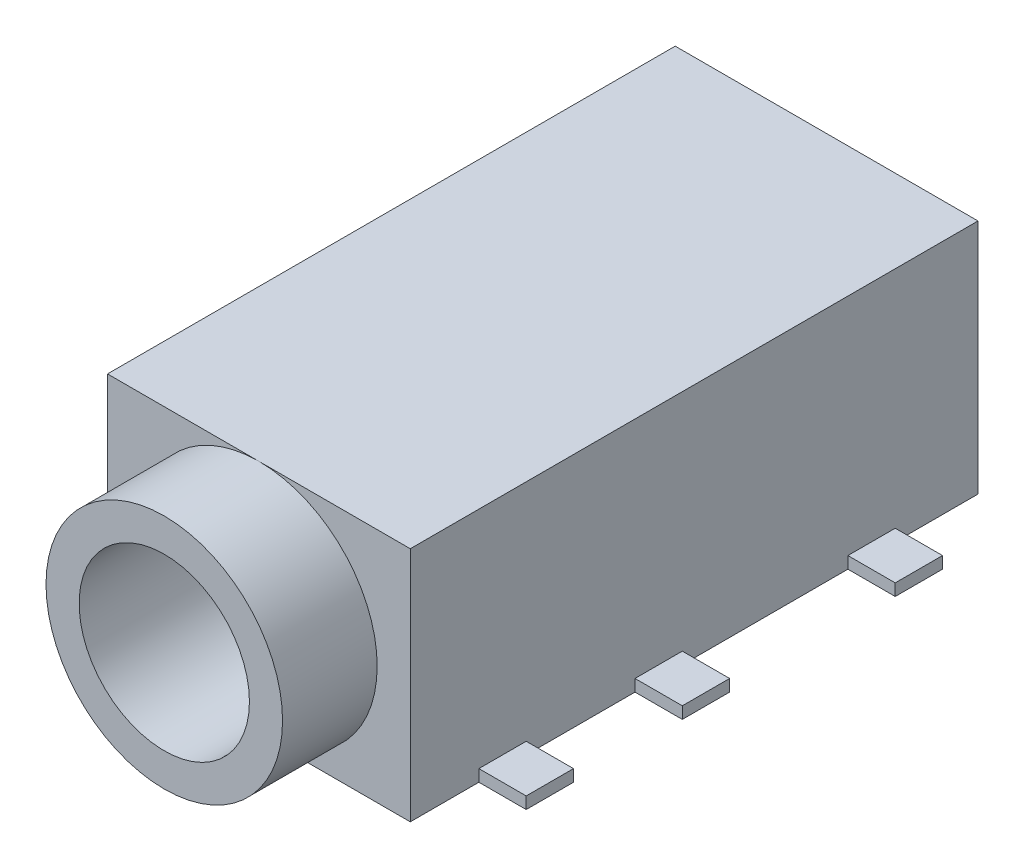
ISO-10303-21;
HEADER;
FILE_DESCRIPTION(('STEP AP214'),'2;1');
FILE_NAME('part.step','',(''),(''),'','','');
FILE_SCHEMA(('AUTOMOTIVE_DESIGN { 1 0 10303 214 1 1 1 1 }'));
ENDSEC;
DATA;
#1=APPLICATION_CONTEXT('core data for automotive mechanical design processes');
#2=APPLICATION_PROTOCOL_DEFINITION('international standard','automotive_design',2000,#1);
#3=PRODUCT_CONTEXT('',#1,'mechanical');
#4=PRODUCT('Part','Part','',(#3));
#5=PRODUCT_RELATED_PRODUCT_CATEGORY('part','',(#4));
#6=PRODUCT_DEFINITION_FORMATION('','',#4);
#7=PRODUCT_DEFINITION_CONTEXT('part definition',#1,'design');
#8=PRODUCT_DEFINITION('design','',#6,#7);
#9=PRODUCT_DEFINITION_SHAPE('','',#8);
#10=(LENGTH_UNIT() NAMED_UNIT(*) SI_UNIT(.MILLI.,.METRE.));
#11=(NAMED_UNIT(*) PLANE_ANGLE_UNIT() SI_UNIT($,.RADIAN.));
#12=(NAMED_UNIT(*) SI_UNIT($,.STERADIAN.) SOLID_ANGLE_UNIT());
#13=UNCERTAINTY_MEASURE_WITH_UNIT(LENGTH_MEASURE(1.E-05),#10,'distance_accuracy_value','');
#14=(GEOMETRIC_REPRESENTATION_CONTEXT(3) GLOBAL_UNCERTAINTY_ASSIGNED_CONTEXT((#13)) GLOBAL_UNIT_ASSIGNED_CONTEXT((#10,
#11,#12)) REPRESENTATION_CONTEXT('',''));
#15=CARTESIAN_POINT('',(0.,0.,0.));
#16=DIRECTION('',(0.,0.,1.));
#17=DIRECTION('',(1.,0.,0.));
#18=AXIS2_PLACEMENT_3D('',#15,#16,#17);
#19=CARTESIAN_POINT('',(-3.2,5.,0.));
#20=DIRECTION('',(1.,0.,0.));
#21=DIRECTION('',(0.,0.,-1.));
#22=AXIS2_PLACEMENT_3D('',#19,#20,#21);
#23=PLANE('',#22);
#24=DIRECTION('',(0.,1.,0.));
#25=VECTOR('',#24,1.);
#26=CARTESIAN_POINT('',(-3.2,0.,-7.));
#27=LINE('',#26,#25);
#28=CARTESIAN_POINT('',(-3.2,0.,-7.));
#29=VERTEX_POINT('',#28);
#30=CARTESIAN_POINT('',(-3.2,0.25,-7.));
#31=VERTEX_POINT('',#30);
#32=EDGE_CURVE('E224',#29,#31,#27,.T.);
#33=ORIENTED_EDGE('',*,*,#32,.F.);
#34=DIRECTION('',(0.,0.,1.));
#35=VECTOR('',#34,1.);
#36=CARTESIAN_POINT('',(-3.2,0.,0.));
#37=LINE('',#36,#35);
#38=CARTESIAN_POINT('',(-3.2,0.,-3.));
#39=VERTEX_POINT('',#38);
#40=EDGE_CURVE('E394',#29,#39,#37,.T.);
#41=ORIENTED_EDGE('',*,*,#40,.T.);
#42=DIRECTION('',(0.,-1.,0.));
#43=VECTOR('',#42,1.);
#44=CARTESIAN_POINT('',(-3.2,0.,-3.));
#45=LINE('',#44,#43);
#46=CARTESIAN_POINT('',(-3.2,0.250000000000001,-3.));
#47=VERTEX_POINT('',#46);
#48=EDGE_CURVE('E238',#47,#39,#45,.T.);
#49=ORIENTED_EDGE('',*,*,#48,.F.);
#50=DIRECTION('',(0.,0.,-1.));
#51=VECTOR('',#50,1.);
#52=CARTESIAN_POINT('',(-3.2,0.250000000000001,-2.));
#53=LINE('',#52,#51);
#54=CARTESIAN_POINT('',(-3.2,0.250000000000001,-2.));
#55=VERTEX_POINT('',#54);
#56=EDGE_CURVE('E228',#55,#47,#53,.T.);
#57=ORIENTED_EDGE('',*,*,#56,.F.);
#58=DIRECTION('',(0.,1.,0.));
#59=VECTOR('',#58,1.);
#60=CARTESIAN_POINT('',(-3.2,0.,-2.));
#61=LINE('',#60,#59);
#62=CARTESIAN_POINT('',(-3.2,0.,-2.));
#63=VERTEX_POINT('',#62);
#64=EDGE_CURVE('E225',#63,#55,#61,.T.);
#65=ORIENTED_EDGE('',*,*,#64,.F.);
#66=CARTESIAN_POINT('',(-3.2,0.,0.));
#67=VERTEX_POINT('',#66);
#68=EDGE_CURVE('E390',#63,#67,#37,.T.);
#69=ORIENTED_EDGE('',*,*,#68,.T.);
#70=DIRECTION('',(0.,-1.,0.));
#71=VECTOR('',#70,1.);
#72=CARTESIAN_POINT('',(-3.2,5.,0.));
#73=LINE('',#72,#71);
#74=CARTESIAN_POINT('',(-3.2,5.,0.));
#75=VERTEX_POINT('',#74);
#76=EDGE_CURVE('E399',#75,#67,#73,.T.);
#77=ORIENTED_EDGE('',*,*,#76,.F.);
#78=DIRECTION('',(0.,0.,1.));
#79=VECTOR('',#78,1.);
#80=CARTESIAN_POINT('',(-3.2,5.,0.));
#81=LINE('',#80,#79);
#82=CARTESIAN_POINT('',(-3.2,5.,-12.));
#83=VERTEX_POINT('',#82);
#84=EDGE_CURVE('E379',#83,#75,#81,.T.);
#85=ORIENTED_EDGE('',*,*,#84,.F.);
#86=DIRECTION('',(0.,-1.,0.));
#87=VECTOR('',#86,1.);
#88=CARTESIAN_POINT('',(-3.2,5.,-12.));
#89=LINE('',#88,#87);
#90=CARTESIAN_POINT('',(-3.2,0.,-12.));
#91=VERTEX_POINT('',#90);
#92=EDGE_CURVE('E401',#83,#91,#89,.T.);
#93=ORIENTED_EDGE('',*,*,#92,.T.);
#94=CARTESIAN_POINT('',(-3.2,0.,-8.));
#95=VERTEX_POINT('',#94);
#96=EDGE_CURVE('E391',#91,#95,#37,.T.);
#97=ORIENTED_EDGE('',*,*,#96,.T.);
#98=DIRECTION('',(0.,-1.,0.));
#99=VECTOR('',#98,1.);
#100=CARTESIAN_POINT('',(-3.2,0.,-8.));
#101=LINE('',#100,#99);
#102=CARTESIAN_POINT('',(-3.2,0.250000000000001,-8.));
#103=VERTEX_POINT('',#102);
#104=EDGE_CURVE('E57',#103,#95,#101,.T.);
#105=ORIENTED_EDGE('',*,*,#104,.F.);
#106=DIRECTION('',(0.,0.,-1.));
#107=VECTOR('',#106,1.);
#108=CARTESIAN_POINT('',(-3.2,0.250000000000001,-7.));
#109=LINE('',#108,#107);
#110=EDGE_CURVE('E52',#31,#103,#109,.T.);
#111=ORIENTED_EDGE('',*,*,#110,.F.);
#112=EDGE_LOOP('',(#33,#41,#49,#57,#65,#69,#77,#85,#93,#97,#105,#111));
#113=FACE_BOUND('',#112,.T.);
#114=ADVANCED_FACE('F35',(#113),#23,.F.);
#115=CARTESIAN_POINT('',(3.2,5.,0.));
#116=DIRECTION('',(-1.,0.,0.));
#117=DIRECTION('',(0.,0.,1.));
#118=AXIS2_PLACEMENT_3D('',#115,#116,#117);
#119=PLANE('',#118);
#120=DIRECTION('',(0.,-1.,0.));
#121=VECTOR('',#120,1.);
#122=CARTESIAN_POINT('',(3.2,0.,-9.25));
#123=LINE('',#122,#121);
#124=CARTESIAN_POINT('',(3.2,0.25,-9.25));
#125=VERTEX_POINT('',#124);
#126=CARTESIAN_POINT('',(3.2,0.,-9.25));
#127=VERTEX_POINT('',#126);
#128=EDGE_CURVE('E264',#125,#127,#123,.T.);
#129=ORIENTED_EDGE('',*,*,#128,.F.);
#130=DIRECTION('',(0.,0.,1.));
#131=VECTOR('',#130,1.);
#132=CARTESIAN_POINT('',(3.2,0.25,-9.25));
#133=LINE('',#132,#131);
#134=CARTESIAN_POINT('',(3.2,0.25,-10.25));
#135=VERTEX_POINT('',#134);
#136=EDGE_CURVE('E271',#135,#125,#133,.T.);
#137=ORIENTED_EDGE('',*,*,#136,.F.);
#138=DIRECTION('',(0.,1.,0.));
#139=VECTOR('',#138,1.);
#140=CARTESIAN_POINT('',(3.2,0.,-10.25));
#141=LINE('',#140,#139);
#142=CARTESIAN_POINT('',(3.2,0.,-10.25));
#143=VERTEX_POINT('',#142);
#144=EDGE_CURVE('E280',#143,#135,#141,.T.);
#145=ORIENTED_EDGE('',*,*,#144,.F.);
#146=DIRECTION('',(0.,0.,-1.));
#147=VECTOR('',#146,1.);
#148=CARTESIAN_POINT('',(3.2,0.,0.));
#149=LINE('',#148,#147);
#150=CARTESIAN_POINT('',(3.2,0.,-12.));
#151=VERTEX_POINT('',#150);
#152=EDGE_CURVE('E370',#143,#151,#149,.T.);
#153=ORIENTED_EDGE('',*,*,#152,.T.);
#154=DIRECTION('',(0.,-1.,0.));
#155=VECTOR('',#154,1.);
#156=CARTESIAN_POINT('',(3.2,5.,-12.));
#157=LINE('',#156,#155);
#158=CARTESIAN_POINT('',(3.2,5.,-12.));
#159=VERTEX_POINT('',#158);
#160=EDGE_CURVE('E39',#159,#151,#157,.T.);
#161=ORIENTED_EDGE('',*,*,#160,.F.);
#162=DIRECTION('',(0.,0.,-1.));
#163=VECTOR('',#162,1.);
#164=CARTESIAN_POINT('',(3.2,5.,0.));
#165=LINE('',#164,#163);
#166=CARTESIAN_POINT('',(3.2,5.,0.));
#167=VERTEX_POINT('',#166);
#168=EDGE_CURVE('E373',#167,#159,#165,.T.);
#169=ORIENTED_EDGE('',*,*,#168,.F.);
#170=DIRECTION('',(0.,-1.,0.));
#171=VECTOR('',#170,1.);
#172=CARTESIAN_POINT('',(3.2,5.,0.));
#173=LINE('',#172,#171);
#174=CARTESIAN_POINT('',(3.2,0.,0.));
#175=VERTEX_POINT('',#174);
#176=EDGE_CURVE('E384',#167,#175,#173,.T.);
#177=ORIENTED_EDGE('',*,*,#176,.T.);
#178=CARTESIAN_POINT('',(3.2,0.,-1.45));
#179=VERTEX_POINT('',#178);
#180=EDGE_CURVE('E385',#175,#179,#149,.T.);
#181=ORIENTED_EDGE('',*,*,#180,.T.);
#182=DIRECTION('',(0.,-1.,0.));
#183=VECTOR('',#182,1.);
#184=CARTESIAN_POINT('',(3.2,0.,-1.45));
#185=LINE('',#184,#183);
#186=CARTESIAN_POINT('',(3.2,0.25,-1.45));
#187=VERTEX_POINT('',#186);
#188=EDGE_CURVE('E326',#187,#179,#185,.T.);
#189=ORIENTED_EDGE('',*,*,#188,.F.);
#190=DIRECTION('',(0.,0.,1.));
#191=VECTOR('',#190,1.);
#192=CARTESIAN_POINT('',(3.2,0.25,-1.45));
#193=LINE('',#192,#191);
#194=CARTESIAN_POINT('',(3.2,0.25,-2.45));
#195=VERTEX_POINT('',#194);
#196=EDGE_CURVE('E331',#195,#187,#193,.T.);
#197=ORIENTED_EDGE('',*,*,#196,.F.);
#198=DIRECTION('',(0.,1.,0.));
#199=VECTOR('',#198,1.);
#200=CARTESIAN_POINT('',(3.2,0.,-2.45));
#201=LINE('',#200,#199);
#202=CARTESIAN_POINT('',(3.2,0.,-2.45));
#203=VERTEX_POINT('',#202);
#204=EDGE_CURVE('E340',#203,#195,#201,.T.);
#205=ORIENTED_EDGE('',*,*,#204,.F.);
#206=CARTESIAN_POINT('',(3.2,0.,-4.75));
#207=VERTEX_POINT('',#206);
#208=EDGE_CURVE('E388',#203,#207,#149,.T.);
#209=ORIENTED_EDGE('',*,*,#208,.T.);
#210=DIRECTION('',(0.,-1.,0.));
#211=VECTOR('',#210,1.);
#212=CARTESIAN_POINT('',(3.2,0.,-4.75));
#213=LINE('',#212,#211);
#214=CARTESIAN_POINT('',(3.2,0.25,-4.75));
#215=VERTEX_POINT('',#214);
#216=EDGE_CURVE('E296',#215,#207,#213,.T.);
#217=ORIENTED_EDGE('',*,*,#216,.F.);
#218=DIRECTION('',(0.,0.,1.));
#219=VECTOR('',#218,1.);
#220=CARTESIAN_POINT('',(3.2,0.25,-4.75));
#221=LINE('',#220,#219);
#222=CARTESIAN_POINT('',(3.2,0.25,-5.75));
#223=VERTEX_POINT('',#222);
#224=EDGE_CURVE('E301',#223,#215,#221,.T.);
#225=ORIENTED_EDGE('',*,*,#224,.F.);
#226=DIRECTION('',(0.,1.,0.));
#227=VECTOR('',#226,1.);
#228=CARTESIAN_POINT('',(3.2,0.,-5.75));
#229=LINE('',#228,#227);
#230=CARTESIAN_POINT('',(3.2,0.,-5.75));
#231=VERTEX_POINT('',#230);
#232=EDGE_CURVE('E310',#231,#223,#229,.T.);
#233=ORIENTED_EDGE('',*,*,#232,.F.);
#234=EDGE_CURVE('E416',#231,#127,#149,.T.);
#235=ORIENTED_EDGE('',*,*,#234,.T.);
#236=EDGE_LOOP('',(#129,#137,#145,#153,#161,#169,#177,#181,#189,#197,#205,#209,#217,#225,#233,#235));
#237=FACE_BOUND('',#236,.T.);
#238=ADVANCED_FACE('F37',(#237),#119,.F.);
#239=CARTESIAN_POINT('',(-3.2,5.,0.));
#240=DIRECTION('',(0.,0.,-1.));
#241=DIRECTION('',(-1.,0.,0.));
#242=AXIS2_PLACEMENT_3D('',#239,#240,#241);
#243=PLANE('',#242);
#244=CARTESIAN_POINT('',(0.,2.5,0.));
#245=DIRECTION('',(0.,0.,1.));
#246=DIRECTION('',(1.,0.,0.));
#247=AXIS2_PLACEMENT_3D('',#244,#245,#246);
#248=CIRCLE('',#247,2.5);
#249=CARTESIAN_POINT('',(0.,5.,0.));
#250=VERTEX_POINT('',#249);
#251=CARTESIAN_POINT('',(0.,0.,0.));
#252=VERTEX_POINT('',#251);
#253=EDGE_CURVE('E45',#250,#252,#248,.T.);
#254=ORIENTED_EDGE('',*,*,#253,.F.);
#255=DIRECTION('',(1.,0.,0.));
#256=VECTOR('',#255,1.);
#257=CARTESIAN_POINT('',(-3.2,5.,0.));
#258=LINE('',#257,#256);
#259=EDGE_CURVE('E382',#75,#250,#258,.T.);
#260=ORIENTED_EDGE('',*,*,#259,.F.);
#261=ORIENTED_EDGE('',*,*,#76,.T.);
#262=DIRECTION('',(1.,0.,0.));
#263=VECTOR('',#262,1.);
#264=CARTESIAN_POINT('',(-3.2,0.,0.));
#265=LINE('',#264,#263);
#266=EDGE_CURVE('E377',#67,#252,#265,.T.);
#267=ORIENTED_EDGE('',*,*,#266,.T.);
#268=EDGE_LOOP('',(#254,#260,#261,#267));
#269=FACE_BOUND('',#268,.T.);
#270=ADVANCED_FACE('F439',(#269),#243,.F.);
#271=CARTESIAN_POINT('',(-3.2,5.,-12.));
#272=DIRECTION('',(0.,0.,1.));
#273=DIRECTION('',(1.,0.,0.));
#274=AXIS2_PLACEMENT_3D('',#271,#272,#273);
#275=PLANE('',#274);
#276=CARTESIAN_POINT('',(0.,2.5,-12.));
#277=DIRECTION('',(0.,0.,1.));
#278=DIRECTION('',(1.,0.,0.));
#279=AXIS2_PLACEMENT_3D('',#276,#277,#278);
#280=CIRCLE('',#279,1.8);
#281=CARTESIAN_POINT('',(1.8,2.5,-12.));
#282=VERTEX_POINT('',#281);
#283=EDGE_CURVE('E261',#282,#282,#280,.T.);
#284=ORIENTED_EDGE('',*,*,#283,.T.);
#285=EDGE_LOOP('',(#284));
#286=FACE_BOUND('',#285,.T.);
#287=DIRECTION('',(-1.,0.,0.));
#288=VECTOR('',#287,1.);
#289=CARTESIAN_POINT('',(-3.2,0.,-12.));
#290=LINE('',#289,#288);
#291=EDGE_CURVE('E387',#151,#91,#290,.T.);
#292=ORIENTED_EDGE('',*,*,#291,.T.);
#293=ORIENTED_EDGE('',*,*,#92,.F.);
#294=DIRECTION('',(-1.,0.,0.));
#295=VECTOR('',#294,1.);
#296=CARTESIAN_POINT('',(-3.2,5.,-12.));
#297=LINE('',#296,#295);
#298=EDGE_CURVE('E376',#159,#83,#297,.T.);
#299=ORIENTED_EDGE('',*,*,#298,.F.);
#300=ORIENTED_EDGE('',*,*,#160,.T.);
#301=EDGE_LOOP('',(#292,#293,#299,#300));
#302=FACE_BOUND('',#301,.T.);
#303=ADVANCED_FACE('F409',(#286,#302),#275,.F.);
#304=EDGE_CURVE('E11',#252,#250,#248,.T.);
#305=ORIENTED_EDGE('',*,*,#304,.F.);
#306=EDGE_CURVE('E393',#252,#175,#265,.T.);
#307=ORIENTED_EDGE('',*,*,#306,.T.);
#308=ORIENTED_EDGE('',*,*,#176,.F.);
#309=EDGE_CURVE('E381',#250,#167,#258,.T.);
#310=ORIENTED_EDGE('',*,*,#309,.F.);
#311=EDGE_LOOP('',(#305,#307,#308,#310));
#312=FACE_BOUND('',#311,.T.);
#313=ADVANCED_FACE('F443',(#312),#243,.F.);
#314=CARTESIAN_POINT('',(0.,5.,0.));
#315=DIRECTION('',(0.,-1.,0.));
#316=DIRECTION('',(0.,0.,-1.));
#317=AXIS2_PLACEMENT_3D('',#314,#315,#316);
#318=PLANE('',#317);
#319=ORIENTED_EDGE('',*,*,#168,.T.);
#320=ORIENTED_EDGE('',*,*,#298,.T.);
#321=ORIENTED_EDGE('',*,*,#84,.T.);
#322=ORIENTED_EDGE('',*,*,#259,.T.);
#323=ORIENTED_EDGE('',*,*,#309,.T.);
#324=EDGE_LOOP('',(#319,#320,#321,#322,#323));
#325=FACE_BOUND('',#324,.T.);
#326=ADVANCED_FACE('F500',(#325),#318,.F.);
#327=CARTESIAN_POINT('',(0.,0.,0.));
#328=DIRECTION('',(0.,-1.,0.));
#329=DIRECTION('',(0.,0.,-1.));
#330=AXIS2_PLACEMENT_3D('',#327,#328,#329);
#331=PLANE('',#330);
#332=CARTESIAN_POINT('',(0.,0.,-9.));
#333=DIRECTION('',(0.,-1.,0.));
#334=DIRECTION('',(0.,0.,-1.));
#335=AXIS2_PLACEMENT_3D('',#332,#333,#334);
#336=CIRCLE('',#335,0.8);
#337=CARTESIAN_POINT('',(0.,0.,-9.8));
#338=VERTEX_POINT('',#337);
#339=EDGE_CURVE('E356',#338,#338,#336,.T.);
#340=ORIENTED_EDGE('',*,*,#339,.F.);
#341=EDGE_LOOP('',(#340));
#342=FACE_BOUND('',#341,.T.);
#343=CARTESIAN_POINT('',(0.,0.,-3.));
#344=DIRECTION('',(0.,-1.,0.));
#345=DIRECTION('',(0.,0.,-1.));
#346=AXIS2_PLACEMENT_3D('',#343,#344,#345);
#347=CIRCLE('',#346,0.8);
#348=CARTESIAN_POINT('',(0.,0.,-3.8));
#349=VERTEX_POINT('',#348);
#350=EDGE_CURVE('E360',#349,#349,#347,.T.);
#351=ORIENTED_EDGE('',*,*,#350,.F.);
#352=EDGE_LOOP('',(#351));
#353=FACE_BOUND('',#352,.T.);
#354=ORIENTED_EDGE('',*,*,#180,.F.);
#355=ORIENTED_EDGE('',*,*,#306,.F.);
#356=ORIENTED_EDGE('',*,*,#266,.F.);
#357=ORIENTED_EDGE('',*,*,#68,.F.);
#358=DIRECTION('',(1.,0.,0.));
#359=VECTOR('',#358,1.);
#360=CARTESIAN_POINT('',(-4.2,0.,-2.));
#361=LINE('',#360,#359);
#362=CARTESIAN_POINT('',(-4.2,0.,-2.));
#363=VERTEX_POINT('',#362);
#364=EDGE_CURVE('E243',#363,#63,#361,.T.);
#365=ORIENTED_EDGE('',*,*,#364,.F.);
#366=DIRECTION('',(0.,0.,1.));
#367=VECTOR('',#366,1.);
#368=CARTESIAN_POINT('',(-4.2,0.,-2.));
#369=LINE('',#368,#367);
#370=CARTESIAN_POINT('',(-4.2,0.,-3.));
#371=VERTEX_POINT('',#370);
#372=EDGE_CURVE('E242',#371,#363,#369,.T.);
#373=ORIENTED_EDGE('',*,*,#372,.F.);
#374=DIRECTION('',(1.,0.,0.));
#375=VECTOR('',#374,1.);
#376=CARTESIAN_POINT('',(-4.2,0.,-3.));
#377=LINE('',#376,#375);
#378=EDGE_CURVE('E251',#371,#39,#377,.T.);
#379=ORIENTED_EDGE('',*,*,#378,.T.);
#380=ORIENTED_EDGE('',*,*,#40,.F.);
#381=DIRECTION('',(1.,0.,0.));
#382=VECTOR('',#381,1.);
#383=CARTESIAN_POINT('',(-4.2,0.,-7.));
#384=LINE('',#383,#382);
#385=CARTESIAN_POINT('',(-4.2,0.,-7.));
#386=VERTEX_POINT('',#385);
#387=EDGE_CURVE('E427',#386,#29,#384,.T.);
#388=ORIENTED_EDGE('',*,*,#387,.F.);
#389=DIRECTION('',(0.,0.,1.));
#390=VECTOR('',#389,1.);
#391=CARTESIAN_POINT('',(-4.2,0.,-7.));
#392=LINE('',#391,#390);
#393=CARTESIAN_POINT('',(-4.2,0.,-8.));
#394=VERTEX_POINT('',#393);
#395=EDGE_CURVE('E218',#394,#386,#392,.T.);
#396=ORIENTED_EDGE('',*,*,#395,.F.);
#397=DIRECTION('',(1.,0.,0.));
#398=VECTOR('',#397,1.);
#399=CARTESIAN_POINT('',(-4.2,0.,-8.));
#400=LINE('',#399,#398);
#401=EDGE_CURVE('E230',#394,#95,#400,.T.);
#402=ORIENTED_EDGE('',*,*,#401,.T.);
#403=ORIENTED_EDGE('',*,*,#96,.F.);
#404=ORIENTED_EDGE('',*,*,#291,.F.);
#405=ORIENTED_EDGE('',*,*,#152,.F.);
#406=DIRECTION('',(-1.,0.,0.));
#407=VECTOR('',#406,1.);
#408=CARTESIAN_POINT('',(4.2,0.,-10.25));
#409=LINE('',#408,#407);
#410=CARTESIAN_POINT('',(4.2,0.,-10.25));
#411=VERTEX_POINT('',#410);
#412=EDGE_CURVE('E290',#411,#143,#409,.T.);
#413=ORIENTED_EDGE('',*,*,#412,.F.);
#414=DIRECTION('',(0.,0.,-1.));
#415=VECTOR('',#414,1.);
#416=CARTESIAN_POINT('',(4.2,0.,-9.25));
#417=LINE('',#416,#415);
#418=CARTESIAN_POINT('',(4.2,0.,-9.25));
#419=VERTEX_POINT('',#418);
#420=EDGE_CURVE('E270',#419,#411,#417,.T.);
#421=ORIENTED_EDGE('',*,*,#420,.F.);
#422=DIRECTION('',(-1.,0.,0.));
#423=VECTOR('',#422,1.);
#424=CARTESIAN_POINT('',(4.2,0.,-9.25));
#425=LINE('',#424,#423);
#426=EDGE_CURVE('E293',#419,#127,#425,.T.);
#427=ORIENTED_EDGE('',*,*,#426,.T.);
#428=ORIENTED_EDGE('',*,*,#234,.F.);
#429=DIRECTION('',(-1.,0.,0.));
#430=VECTOR('',#429,1.);
#431=CARTESIAN_POINT('',(4.2,0.,-5.75));
#432=LINE('',#431,#430);
#433=CARTESIAN_POINT('',(4.2,0.,-5.75));
#434=VERTEX_POINT('',#433);
#435=EDGE_CURVE('E320',#434,#231,#432,.T.);
#436=ORIENTED_EDGE('',*,*,#435,.F.);
#437=DIRECTION('',(0.,0.,-1.));
#438=VECTOR('',#437,1.);
#439=CARTESIAN_POINT('',(4.2,0.,-4.75));
#440=LINE('',#439,#438);
#441=CARTESIAN_POINT('',(4.2,0.,-4.75));
#442=VERTEX_POINT('',#441);
#443=EDGE_CURVE('E300',#442,#434,#440,.T.);
#444=ORIENTED_EDGE('',*,*,#443,.F.);
#445=DIRECTION('',(-1.,0.,0.));
#446=VECTOR('',#445,1.);
#447=CARTESIAN_POINT('',(4.2,0.,-4.75));
#448=LINE('',#447,#446);
#449=EDGE_CURVE('E323',#442,#207,#448,.T.);
#450=ORIENTED_EDGE('',*,*,#449,.T.);
#451=ORIENTED_EDGE('',*,*,#208,.F.);
#452=DIRECTION('',(-1.,0.,0.));
#453=VECTOR('',#452,1.);
#454=CARTESIAN_POINT('',(4.2,0.,-2.45));
#455=LINE('',#454,#453);
#456=CARTESIAN_POINT('',(4.2,0.,-2.45));
#457=VERTEX_POINT('',#456);
#458=EDGE_CURVE('E350',#457,#203,#455,.T.);
#459=ORIENTED_EDGE('',*,*,#458,.F.);
#460=DIRECTION('',(0.,0.,-1.));
#461=VECTOR('',#460,1.);
#462=CARTESIAN_POINT('',(4.2,0.,-1.45));
#463=LINE('',#462,#461);
#464=CARTESIAN_POINT('',(4.2,0.,-1.45));
#465=VERTEX_POINT('',#464);
#466=EDGE_CURVE('E330',#465,#457,#463,.T.);
#467=ORIENTED_EDGE('',*,*,#466,.F.);
#468=DIRECTION('',(-1.,0.,0.));
#469=VECTOR('',#468,1.);
#470=CARTESIAN_POINT('',(4.2,0.,-1.45));
#471=LINE('',#470,#469);
#472=EDGE_CURVE('E353',#465,#179,#471,.T.);
#473=ORIENTED_EDGE('',*,*,#472,.T.);
#474=EDGE_LOOP('',(#354,#355,#356,#357,#365,#373,#379,#380,#388,#396,#402,#403,#404,#405,#413,
#421,#427,#428,#436,#444,#450,#451,#459,#467,#473));
#475=FACE_BOUND('',#474,.T.);
#476=ADVANCED_FACE('F418',(#342,#353,#475),#331,.T.);
#477=CARTESIAN_POINT('',(0.,2.5,2.));
#478=DIRECTION('',(0.,0.,-1.));
#479=DIRECTION('',(-1.,0.,0.));
#480=AXIS2_PLACEMENT_3D('',#477,#478,#479);
#481=CYLINDRICAL_SURFACE('',#480,2.5);
#482=CARTESIAN_POINT('',(0.,2.5,2.));
#483=DIRECTION('',(0.,0.,1.));
#484=DIRECTION('',(1.,0.,0.));
#485=AXIS2_PLACEMENT_3D('',#482,#483,#484);
#486=CIRCLE('',#485,2.5);
#487=CARTESIAN_POINT('',(2.5,2.5,2.));
#488=VERTEX_POINT('',#487);
#489=EDGE_CURVE('E368',#488,#488,#486,.T.);
#490=ORIENTED_EDGE('',*,*,#489,.F.);
#491=EDGE_LOOP('',(#490));
#492=FACE_BOUND('',#491,.T.);
#493=ORIENTED_EDGE('',*,*,#253,.T.);
#494=ORIENTED_EDGE('',*,*,#304,.T.);
#495=EDGE_LOOP('',(#493,#494));
#496=FACE_BOUND('',#495,.T.);
#497=ADVANCED_FACE('F509',(#492,#496),#481,.T.);
#498=CARTESIAN_POINT('',(0.,2.5,2.));
#499=DIRECTION('',(0.,0.,1.));
#500=DIRECTION('',(1.,0.,0.));
#501=AXIS2_PLACEMENT_3D('',#498,#499,#500);
#502=PLANE('',#501);
#503=CARTESIAN_POINT('',(0.,2.5,2.));
#504=DIRECTION('',(0.,0.,1.));
#505=DIRECTION('',(1.,0.,0.));
#506=AXIS2_PLACEMENT_3D('',#503,#504,#505);
#507=CIRCLE('',#506,1.8);
#508=CARTESIAN_POINT('',(1.8,2.5,2.));
#509=VERTEX_POINT('',#508);
#510=EDGE_CURVE('E260',#509,#509,#507,.T.);
#511=ORIENTED_EDGE('',*,*,#510,.F.);
#512=EDGE_LOOP('',(#511));
#513=FACE_BOUND('',#512,.T.);
#514=ORIENTED_EDGE('',*,*,#489,.T.);
#515=EDGE_LOOP('',(#514));
#516=FACE_BOUND('',#515,.T.);
#517=ADVANCED_FACE('F505',(#513,#516),#502,.T.);
#518=CARTESIAN_POINT('',(0.,-0.5,-3.));
#519=DIRECTION('',(0.,1.,0.));
#520=DIRECTION('',(0.,0.,1.));
#521=AXIS2_PLACEMENT_3D('',#518,#519,#520);
#522=CYLINDRICAL_SURFACE('',#521,0.8);
#523=CARTESIAN_POINT('',(0.,-0.5,-3.));
#524=DIRECTION('',(0.,-1.,0.));
#525=DIRECTION('',(0.,0.,-1.));
#526=AXIS2_PLACEMENT_3D('',#523,#524,#525);
#527=CIRCLE('',#526,0.8);
#528=CARTESIAN_POINT('',(0.,-0.5,-3.8));
#529=VERTEX_POINT('',#528);
#530=EDGE_CURVE('E363',#529,#529,#527,.T.);
#531=ORIENTED_EDGE('',*,*,#530,.F.);
#532=EDGE_LOOP('',(#531));
#533=FACE_BOUND('',#532,.T.);
#534=ORIENTED_EDGE('',*,*,#350,.T.);
#535=EDGE_LOOP('',(#534));
#536=FACE_BOUND('',#535,.T.);
#537=ADVANCED_FACE('F508',(#533,#536),#522,.T.);
#538=CARTESIAN_POINT('',(0.,-0.5,-3.));
#539=DIRECTION('',(0.,-1.,0.));
#540=DIRECTION('',(0.,0.,-1.));
#541=AXIS2_PLACEMENT_3D('',#538,#539,#540);
#542=PLANE('',#541);
#543=ORIENTED_EDGE('',*,*,#530,.T.);
#544=EDGE_LOOP('',(#543));
#545=FACE_BOUND('',#544,.T.);
#546=ADVANCED_FACE('F758',(#545),#542,.T.);
#547=CARTESIAN_POINT('',(0.,-0.5,-9.));
#548=DIRECTION('',(0.,1.,0.));
#549=DIRECTION('',(0.,0.,1.));
#550=AXIS2_PLACEMENT_3D('',#547,#548,#549);
#551=CYLINDRICAL_SURFACE('',#550,0.8);
#552=CARTESIAN_POINT('',(0.,-0.5,-9.));
#553=DIRECTION('',(0.,-1.,0.));
#554=DIRECTION('',(0.,0.,-1.));
#555=AXIS2_PLACEMENT_3D('',#552,#553,#554);
#556=CIRCLE('',#555,0.8);
#557=CARTESIAN_POINT('',(0.,-0.5,-9.8));
#558=VERTEX_POINT('',#557);
#559=EDGE_CURVE('E357',#558,#558,#556,.T.);
#560=ORIENTED_EDGE('',*,*,#559,.F.);
#561=EDGE_LOOP('',(#560));
#562=FACE_BOUND('',#561,.T.);
#563=ORIENTED_EDGE('',*,*,#339,.T.);
#564=EDGE_LOOP('',(#563));
#565=FACE_BOUND('',#564,.T.);
#566=ADVANCED_FACE('F748',(#562,#565),#551,.T.);
#567=CARTESIAN_POINT('',(0.,-0.5,-9.));
#568=DIRECTION('',(0.,-1.,0.));
#569=DIRECTION('',(0.,0.,-1.));
#570=AXIS2_PLACEMENT_3D('',#567,#568,#569);
#571=PLANE('',#570);
#572=ORIENTED_EDGE('',*,*,#559,.T.);
#573=EDGE_LOOP('',(#572));
#574=FACE_BOUND('',#573,.T.);
#575=ADVANCED_FACE('F731',(#574),#571,.T.);
#576=CARTESIAN_POINT('',(4.2,0.,-1.45));
#577=DIRECTION('',(0.,0.,-1.));
#578=DIRECTION('',(-1.,0.,0.));
#579=AXIS2_PLACEMENT_3D('',#576,#577,#578);
#580=PLANE('',#579);
#581=ORIENTED_EDGE('',*,*,#188,.T.);
#582=ORIENTED_EDGE('',*,*,#472,.F.);
#583=DIRECTION('',(0.,-1.,0.));
#584=VECTOR('',#583,1.);
#585=CARTESIAN_POINT('',(4.2,0.,-1.45));
#586=LINE('',#585,#584);
#587=CARTESIAN_POINT('',(4.2,0.25,-1.45));
#588=VERTEX_POINT('',#587);
#589=EDGE_CURVE('E327',#588,#465,#586,.T.);
#590=ORIENTED_EDGE('',*,*,#589,.F.);
#591=DIRECTION('',(-1.,0.,0.));
#592=VECTOR('',#591,1.);
#593=CARTESIAN_POINT('',(4.2,0.25,-1.45));
#594=LINE('',#593,#592);
#595=EDGE_CURVE('E337',#588,#187,#594,.T.);
#596=ORIENTED_EDGE('',*,*,#595,.T.);
#597=EDGE_LOOP('',(#581,#582,#590,#596));
#598=FACE_BOUND('',#597,.T.);
#599=ADVANCED_FACE('F449',(#598),#580,.F.);
#600=CARTESIAN_POINT('',(4.2,0.,-2.45));
#601=DIRECTION('',(0.,0.,1.));
#602=DIRECTION('',(1.,0.,0.));
#603=AXIS2_PLACEMENT_3D('',#600,#601,#602);
#604=PLANE('',#603);
#605=ORIENTED_EDGE('',*,*,#204,.T.);
#606=DIRECTION('',(-1.,0.,0.));
#607=VECTOR('',#606,1.);
#608=CARTESIAN_POINT('',(4.2,0.25,-2.45));
#609=LINE('',#608,#607);
#610=CARTESIAN_POINT('',(4.2,0.25,-2.45));
#611=VERTEX_POINT('',#610);
#612=EDGE_CURVE('E347',#611,#195,#609,.T.);
#613=ORIENTED_EDGE('',*,*,#612,.F.);
#614=DIRECTION('',(0.,1.,0.));
#615=VECTOR('',#614,1.);
#616=CARTESIAN_POINT('',(4.2,0.,-2.45));
#617=LINE('',#616,#615);
#618=EDGE_CURVE('E333',#457,#611,#617,.T.);
#619=ORIENTED_EDGE('',*,*,#618,.F.);
#620=ORIENTED_EDGE('',*,*,#458,.T.);
#621=EDGE_LOOP('',(#605,#613,#619,#620));
#622=FACE_BOUND('',#621,.T.);
#623=ADVANCED_FACE('F457',(#622),#604,.F.);
#624=CARTESIAN_POINT('',(4.2,0.25,-1.45));
#625=DIRECTION('',(0.,-1.,0.));
#626=DIRECTION('',(0.,0.,-1.));
#627=AXIS2_PLACEMENT_3D('',#624,#625,#626);
#628=PLANE('',#627);
#629=ORIENTED_EDGE('',*,*,#196,.T.);
#630=ORIENTED_EDGE('',*,*,#595,.F.);
#631=DIRECTION('',(0.,0.,1.));
#632=VECTOR('',#631,1.);
#633=CARTESIAN_POINT('',(4.2,0.25,-1.45));
#634=LINE('',#633,#632);
#635=EDGE_CURVE('E335',#611,#588,#634,.T.);
#636=ORIENTED_EDGE('',*,*,#635,.F.);
#637=ORIENTED_EDGE('',*,*,#612,.T.);
#638=EDGE_LOOP('',(#629,#630,#636,#637));
#639=FACE_BOUND('',#638,.T.);
#640=ADVANCED_FACE('F453',(#639),#628,.F.);
#641=CARTESIAN_POINT('',(4.2,0.,0.));
#642=DIRECTION('',(-1.,0.,0.));
#643=DIRECTION('',(0.,0.,1.));
#644=AXIS2_PLACEMENT_3D('',#641,#642,#643);
#645=PLANE('',#644);
#646=ORIENTED_EDGE('',*,*,#589,.T.);
#647=ORIENTED_EDGE('',*,*,#466,.T.);
#648=ORIENTED_EDGE('',*,*,#618,.T.);
#649=ORIENTED_EDGE('',*,*,#635,.T.);
#650=EDGE_LOOP('',(#646,#647,#648,#649));
#651=FACE_BOUND('',#650,.T.);
#652=ADVANCED_FACE('F696',(#651),#645,.F.);
#653=CARTESIAN_POINT('',(4.2,0.,-4.75));
#654=DIRECTION('',(0.,0.,-1.));
#655=DIRECTION('',(-1.,0.,0.));
#656=AXIS2_PLACEMENT_3D('',#653,#654,#655);
#657=PLANE('',#656);
#658=ORIENTED_EDGE('',*,*,#216,.T.);
#659=ORIENTED_EDGE('',*,*,#449,.F.);
#660=DIRECTION('',(0.,-1.,0.));
#661=VECTOR('',#660,1.);
#662=CARTESIAN_POINT('',(4.2,0.,-4.75));
#663=LINE('',#662,#661);
#664=CARTESIAN_POINT('',(4.2,0.25,-4.75));
#665=VERTEX_POINT('',#664);
#666=EDGE_CURVE('E297',#665,#442,#663,.T.);
#667=ORIENTED_EDGE('',*,*,#666,.F.);
#668=DIRECTION('',(-1.,0.,0.));
#669=VECTOR('',#668,1.);
#670=CARTESIAN_POINT('',(4.2,0.25,-4.75));
#671=LINE('',#670,#669);
#672=EDGE_CURVE('E307',#665,#215,#671,.T.);
#673=ORIENTED_EDGE('',*,*,#672,.T.);
#674=EDGE_LOOP('',(#658,#659,#667,#673));
#675=FACE_BOUND('',#674,.T.);
#676=ADVANCED_FACE('F686',(#675),#657,.F.);
#677=CARTESIAN_POINT('',(4.2,0.,-5.75));
#678=DIRECTION('',(0.,0.,1.));
#679=DIRECTION('',(1.,0.,0.));
#680=AXIS2_PLACEMENT_3D('',#677,#678,#679);
#681=PLANE('',#680);
#682=ORIENTED_EDGE('',*,*,#232,.T.);
#683=DIRECTION('',(-1.,0.,0.));
#684=VECTOR('',#683,1.);
#685=CARTESIAN_POINT('',(4.2,0.25,-5.75));
#686=LINE('',#685,#684);
#687=CARTESIAN_POINT('',(4.2,0.25,-5.75));
#688=VERTEX_POINT('',#687);
#689=EDGE_CURVE('E317',#688,#223,#686,.T.);
#690=ORIENTED_EDGE('',*,*,#689,.F.);
#691=DIRECTION('',(0.,1.,0.));
#692=VECTOR('',#691,1.);
#693=CARTESIAN_POINT('',(4.2,0.,-5.75));
#694=LINE('',#693,#692);
#695=EDGE_CURVE('E303',#434,#688,#694,.T.);
#696=ORIENTED_EDGE('',*,*,#695,.F.);
#697=ORIENTED_EDGE('',*,*,#435,.T.);
#698=EDGE_LOOP('',(#682,#690,#696,#697));
#699=FACE_BOUND('',#698,.T.);
#700=ADVANCED_FACE('F676',(#699),#681,.F.);
#701=CARTESIAN_POINT('',(4.2,0.25,-4.75));
#702=DIRECTION('',(0.,-1.,0.));
#703=DIRECTION('',(0.,0.,-1.));
#704=AXIS2_PLACEMENT_3D('',#701,#702,#703);
#705=PLANE('',#704);
#706=ORIENTED_EDGE('',*,*,#224,.T.);
#707=ORIENTED_EDGE('',*,*,#672,.F.);
#708=DIRECTION('',(0.,0.,1.));
#709=VECTOR('',#708,1.);
#710=CARTESIAN_POINT('',(4.2,0.25,-4.75));
#711=LINE('',#710,#709);
#712=EDGE_CURVE('E305',#688,#665,#711,.T.);
#713=ORIENTED_EDGE('',*,*,#712,.F.);
#714=ORIENTED_EDGE('',*,*,#689,.T.);
#715=EDGE_LOOP('',(#706,#707,#713,#714));
#716=FACE_BOUND('',#715,.T.);
#717=ADVANCED_FACE('F666',(#716),#705,.F.);
#718=CARTESIAN_POINT('',(4.2,0.,0.));
#719=DIRECTION('',(-1.,0.,0.));
#720=DIRECTION('',(0.,0.,1.));
#721=AXIS2_PLACEMENT_3D('',#718,#719,#720);
#722=PLANE('',#721);
#723=ORIENTED_EDGE('',*,*,#666,.T.);
#724=ORIENTED_EDGE('',*,*,#443,.T.);
#725=ORIENTED_EDGE('',*,*,#695,.T.);
#726=ORIENTED_EDGE('',*,*,#712,.T.);
#727=EDGE_LOOP('',(#723,#724,#725,#726));
#728=FACE_BOUND('',#727,.T.);
#729=ADVANCED_FACE('F657',(#728),#722,.F.);
#730=CARTESIAN_POINT('',(4.2,0.,-9.25));
#731=DIRECTION('',(0.,0.,-1.));
#732=DIRECTION('',(-1.,0.,0.));
#733=AXIS2_PLACEMENT_3D('',#730,#731,#732);
#734=PLANE('',#733);
#735=ORIENTED_EDGE('',*,*,#128,.T.);
#736=ORIENTED_EDGE('',*,*,#426,.F.);
#737=DIRECTION('',(0.,-1.,0.));
#738=VECTOR('',#737,1.);
#739=CARTESIAN_POINT('',(4.2,0.,-9.25));
#740=LINE('',#739,#738);
#741=CARTESIAN_POINT('',(4.2,0.25,-9.25));
#742=VERTEX_POINT('',#741);
#743=EDGE_CURVE('E267',#742,#419,#740,.T.);
#744=ORIENTED_EDGE('',*,*,#743,.F.);
#745=DIRECTION('',(-1.,0.,0.));
#746=VECTOR('',#745,1.);
#747=CARTESIAN_POINT('',(4.2,0.25,-9.25));
#748=LINE('',#747,#746);
#749=EDGE_CURVE('E277',#742,#125,#748,.T.);
#750=ORIENTED_EDGE('',*,*,#749,.T.);
#751=EDGE_LOOP('',(#735,#736,#744,#750));
#752=FACE_BOUND('',#751,.T.);
#753=ADVANCED_FACE('F465',(#752),#734,.F.);
#754=CARTESIAN_POINT('',(4.2,0.,-10.25));
#755=DIRECTION('',(0.,0.,1.));
#756=DIRECTION('',(1.,0.,0.));
#757=AXIS2_PLACEMENT_3D('',#754,#755,#756);
#758=PLANE('',#757);
#759=ORIENTED_EDGE('',*,*,#144,.T.);
#760=DIRECTION('',(-1.,0.,0.));
#761=VECTOR('',#760,1.);
#762=CARTESIAN_POINT('',(4.2,0.25,-10.25));
#763=LINE('',#762,#761);
#764=CARTESIAN_POINT('',(4.2,0.25,-10.25));
#765=VERTEX_POINT('',#764);
#766=EDGE_CURVE('E287',#765,#135,#763,.T.);
#767=ORIENTED_EDGE('',*,*,#766,.F.);
#768=DIRECTION('',(0.,1.,0.));
#769=VECTOR('',#768,1.);
#770=CARTESIAN_POINT('',(4.2,0.,-10.25));
#771=LINE('',#770,#769);
#772=EDGE_CURVE('E273',#411,#765,#771,.T.);
#773=ORIENTED_EDGE('',*,*,#772,.F.);
#774=ORIENTED_EDGE('',*,*,#412,.T.);
#775=EDGE_LOOP('',(#759,#767,#773,#774));
#776=FACE_BOUND('',#775,.T.);
#777=ADVANCED_FACE('F472',(#776),#758,.F.);
#778=CARTESIAN_POINT('',(4.2,0.25,-9.25));
#779=DIRECTION('',(0.,-1.,0.));
#780=DIRECTION('',(0.,0.,-1.));
#781=AXIS2_PLACEMENT_3D('',#778,#779,#780);
#782=PLANE('',#781);
#783=ORIENTED_EDGE('',*,*,#136,.T.);
#784=ORIENTED_EDGE('',*,*,#749,.F.);
#785=DIRECTION('',(0.,0.,1.));
#786=VECTOR('',#785,1.);
#787=CARTESIAN_POINT('',(4.2,0.25,-9.25));
#788=LINE('',#787,#786);
#789=EDGE_CURVE('E275',#765,#742,#788,.T.);
#790=ORIENTED_EDGE('',*,*,#789,.F.);
#791=ORIENTED_EDGE('',*,*,#766,.T.);
#792=EDGE_LOOP('',(#783,#784,#790,#791));
#793=FACE_BOUND('',#792,.T.);
#794=ADVANCED_FACE('F469',(#793),#782,.F.);
#795=CARTESIAN_POINT('',(4.2,0.,0.));
#796=DIRECTION('',(-1.,0.,0.));
#797=DIRECTION('',(0.,0.,1.));
#798=AXIS2_PLACEMENT_3D('',#795,#796,#797);
#799=PLANE('',#798);
#800=ORIENTED_EDGE('',*,*,#743,.T.);
#801=ORIENTED_EDGE('',*,*,#420,.T.);
#802=ORIENTED_EDGE('',*,*,#772,.T.);
#803=ORIENTED_EDGE('',*,*,#789,.T.);
#804=EDGE_LOOP('',(#800,#801,#802,#803));
#805=FACE_BOUND('',#804,.T.);
#806=ADVANCED_FACE('F475',(#805),#799,.F.);
#807=CARTESIAN_POINT('',(0.,2.5,-12.));
#808=DIRECTION('',(0.,0.,1.));
#809=DIRECTION('',(1.,0.,0.));
#810=AXIS2_PLACEMENT_3D('',#807,#808,#809);
#811=CYLINDRICAL_SURFACE('',#810,1.8);
#812=ORIENTED_EDGE('',*,*,#283,.F.);
#813=EDGE_LOOP('',(#812));
#814=FACE_BOUND('',#813,.T.);
#815=ORIENTED_EDGE('',*,*,#510,.T.);
#816=EDGE_LOOP('',(#815));
#817=FACE_BOUND('',#816,.T.);
#818=ADVANCED_FACE('F477',(#814,#817),#811,.F.);
#819=CARTESIAN_POINT('',(-4.2,0.,-2.));
#820=DIRECTION('',(0.,0.,-1.));
#821=DIRECTION('',(-1.,0.,0.));
#822=AXIS2_PLACEMENT_3D('',#819,#820,#821);
#823=PLANE('',#822);
#824=ORIENTED_EDGE('',*,*,#64,.T.);
#825=DIRECTION('',(1.,0.,0.));
#826=VECTOR('',#825,1.);
#827=CARTESIAN_POINT('',(-4.2,0.250000000000001,-2.));
#828=LINE('',#827,#826);
#829=CARTESIAN_POINT('',(-4.2,0.250000000000001,-2.));
#830=VERTEX_POINT('',#829);
#831=EDGE_CURVE('E257',#830,#55,#828,.T.);
#832=ORIENTED_EDGE('',*,*,#831,.F.);
#833=DIRECTION('',(0.,1.,0.));
#834=VECTOR('',#833,1.);
#835=CARTESIAN_POINT('',(-4.2,0.,-2.));
#836=LINE('',#835,#834);
#837=EDGE_CURVE('E234',#363,#830,#836,.T.);
#838=ORIENTED_EDGE('',*,*,#837,.F.);
#839=ORIENTED_EDGE('',*,*,#364,.T.);
#840=EDGE_LOOP('',(#824,#832,#838,#839));
#841=FACE_BOUND('',#840,.T.);
#842=ADVANCED_FACE('F483',(#841),#823,.F.);
#843=CARTESIAN_POINT('',(-4.2,0.250000000000001,-2.));
#844=DIRECTION('',(0.,-1.,0.));
#845=DIRECTION('',(0.,0.,-1.));
#846=AXIS2_PLACEMENT_3D('',#843,#844,#845);
#847=PLANE('',#846);
#848=ORIENTED_EDGE('',*,*,#56,.T.);
#849=DIRECTION('',(1.,0.,0.));
#850=VECTOR('',#849,1.);
#851=CARTESIAN_POINT('',(-4.2,0.250000000000001,-3.));
#852=LINE('',#851,#850);
#853=CARTESIAN_POINT('',(-4.2,0.250000000000001,-3.));
#854=VERTEX_POINT('',#853);
#855=EDGE_CURVE('E254',#854,#47,#852,.T.);
#856=ORIENTED_EDGE('',*,*,#855,.F.);
#857=DIRECTION('',(0.,0.,-1.));
#858=VECTOR('',#857,1.);
#859=CARTESIAN_POINT('',(-4.2,0.250000000000001,-2.));
#860=LINE('',#859,#858);
#861=EDGE_CURVE('E237',#830,#854,#860,.T.);
#862=ORIENTED_EDGE('',*,*,#861,.F.);
#863=ORIENTED_EDGE('',*,*,#831,.T.);
#864=EDGE_LOOP('',(#848,#856,#862,#863));
#865=FACE_BOUND('',#864,.T.);
#866=ADVANCED_FACE('F545',(#865),#847,.F.);
#867=CARTESIAN_POINT('',(-4.2,0.,-3.));
#868=DIRECTION('',(0.,0.,1.));
#869=DIRECTION('',(1.,0.,0.));
#870=AXIS2_PLACEMENT_3D('',#867,#868,#869);
#871=PLANE('',#870);
#872=ORIENTED_EDGE('',*,*,#48,.T.);
#873=ORIENTED_EDGE('',*,*,#378,.F.);
#874=DIRECTION('',(0.,-1.,0.));
#875=VECTOR('',#874,1.);
#876=CARTESIAN_POINT('',(-4.2,0.,-3.));
#877=LINE('',#876,#875);
#878=EDGE_CURVE('E240',#854,#371,#877,.T.);
#879=ORIENTED_EDGE('',*,*,#878,.F.);
#880=ORIENTED_EDGE('',*,*,#855,.T.);
#881=EDGE_LOOP('',(#872,#873,#879,#880));
#882=FACE_BOUND('',#881,.T.);
#883=ADVANCED_FACE('F555',(#882),#871,.F.);
#884=CARTESIAN_POINT('',(-4.2,0.,0.));
#885=DIRECTION('',(-1.,0.,0.));
#886=DIRECTION('',(0.,0.,1.));
#887=AXIS2_PLACEMENT_3D('',#884,#885,#886);
#888=PLANE('',#887);
#889=ORIENTED_EDGE('',*,*,#837,.T.);
#890=ORIENTED_EDGE('',*,*,#861,.T.);
#891=ORIENTED_EDGE('',*,*,#878,.T.);
#892=ORIENTED_EDGE('',*,*,#372,.T.);
#893=EDGE_LOOP('',(#889,#890,#891,#892));
#894=FACE_BOUND('',#893,.T.);
#895=ADVANCED_FACE('F565',(#894),#888,.T.);
#896=CARTESIAN_POINT('',(-4.2,0.,-7.));
#897=DIRECTION('',(0.,0.,-1.));
#898=DIRECTION('',(-1.,0.,0.));
#899=AXIS2_PLACEMENT_3D('',#896,#897,#898);
#900=PLANE('',#899);
#901=ORIENTED_EDGE('',*,*,#32,.T.);
#902=DIRECTION('',(1.,0.,0.));
#903=VECTOR('',#902,1.);
#904=CARTESIAN_POINT('',(-4.2,0.250000000000001,-7.));
#905=LINE('',#904,#903);
#906=CARTESIAN_POINT('',(-4.2,0.250000000000001,-7.));
#907=VERTEX_POINT('',#906);
#908=EDGE_CURVE('E206',#907,#31,#905,.T.);
#909=ORIENTED_EDGE('',*,*,#908,.F.);
#910=DIRECTION('',(0.,1.,0.));
#911=VECTOR('',#910,1.);
#912=CARTESIAN_POINT('',(-4.2,0.,-7.));
#913=LINE('',#912,#911);
#914=EDGE_CURVE('E213',#386,#907,#913,.T.);
#915=ORIENTED_EDGE('',*,*,#914,.F.);
#916=ORIENTED_EDGE('',*,*,#387,.T.);
#917=EDGE_LOOP('',(#901,#909,#915,#916));
#918=FACE_BOUND('',#917,.T.);
#919=ADVANCED_FACE('F223',(#918),#900,.F.);
#920=CARTESIAN_POINT('',(-4.2,0.250000000000001,-7.));
#921=DIRECTION('',(0.,-1.,0.));
#922=DIRECTION('',(0.,0.,-1.));
#923=AXIS2_PLACEMENT_3D('',#920,#921,#922);
#924=PLANE('',#923);
#925=ORIENTED_EDGE('',*,*,#110,.T.);
#926=DIRECTION('',(1.,0.,0.));
#927=VECTOR('',#926,1.);
#928=CARTESIAN_POINT('',(-4.2,0.25,-8.));
#929=LINE('',#928,#927);
#930=CARTESIAN_POINT('',(-4.2,0.25,-8.));
#931=VERTEX_POINT('',#930);
#932=EDGE_CURVE('E209',#931,#103,#929,.T.);
#933=ORIENTED_EDGE('',*,*,#932,.F.);
#934=DIRECTION('',(0.,0.,-1.));
#935=VECTOR('',#934,1.);
#936=CARTESIAN_POINT('',(-4.2,0.250000000000001,-7.));
#937=LINE('',#936,#935);
#938=EDGE_CURVE('E202',#907,#931,#937,.T.);
#939=ORIENTED_EDGE('',*,*,#938,.F.);
#940=ORIENTED_EDGE('',*,*,#908,.T.);
#941=EDGE_LOOP('',(#925,#933,#939,#940));
#942=FACE_BOUND('',#941,.T.);
#943=ADVANCED_FACE('F204',(#942),#924,.F.);
#944=CARTESIAN_POINT('',(-4.2,0.,-8.));
#945=DIRECTION('',(0.,0.,1.));
#946=DIRECTION('',(1.,0.,0.));
#947=AXIS2_PLACEMENT_3D('',#944,#945,#946);
#948=PLANE('',#947);
#949=ORIENTED_EDGE('',*,*,#104,.T.);
#950=ORIENTED_EDGE('',*,*,#401,.F.);
#951=DIRECTION('',(0.,-1.,0.));
#952=VECTOR('',#951,1.);
#953=CARTESIAN_POINT('',(-4.2,0.,-8.));
#954=LINE('',#953,#952);
#955=EDGE_CURVE('E212',#931,#394,#954,.T.);
#956=ORIENTED_EDGE('',*,*,#955,.F.);
#957=ORIENTED_EDGE('',*,*,#932,.T.);
#958=EDGE_LOOP('',(#949,#950,#956,#957));
#959=FACE_BOUND('',#958,.T.);
#960=ADVANCED_FACE('F422',(#959),#948,.F.);
#961=CARTESIAN_POINT('',(-4.2,0.,0.));
#962=DIRECTION('',(-1.,0.,0.));
#963=DIRECTION('',(0.,0.,1.));
#964=AXIS2_PLACEMENT_3D('',#961,#962,#963);
#965=PLANE('',#964);
#966=ORIENTED_EDGE('',*,*,#914,.T.);
#967=ORIENTED_EDGE('',*,*,#938,.T.);
#968=ORIENTED_EDGE('',*,*,#955,.T.);
#969=ORIENTED_EDGE('',*,*,#395,.T.);
#970=EDGE_LOOP('',(#966,#967,#968,#969));
#971=FACE_BOUND('',#970,.T.);
#972=ADVANCED_FACE('F216',(#971),#965,.T.);
#973=CLOSED_SHELL('',(#114,#238,#270,#303,#313,#326,#476,#497,#517,#537,#546,#566,#575,#599,
#623,#640,#652,#676,#700,#717,#729,#753,#777,#794,#806,#818,#842,#866,#883,#895,#919,#943,#960,#972));
#974=MANIFOLD_SOLID_BREP('B2',#973);
#975=ADVANCED_BREP_SHAPE_REPRESENTATION('',(#18,#974),#14);
#976=SHAPE_DEFINITION_REPRESENTATION(#9,#975);
ENDSEC;
END-ISO-10303-21;
